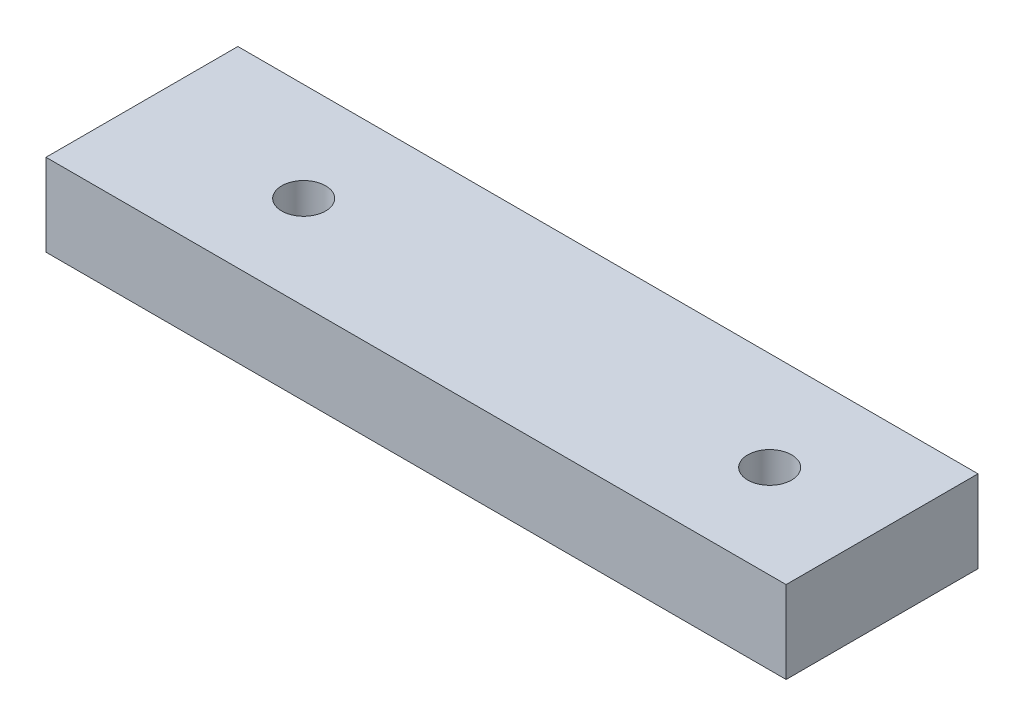
ISO-10303-21;
HEADER;
FILE_DESCRIPTION(('STEP AP214'),'2;1');
FILE_NAME('part.step','',(''),(''),'','','');
FILE_SCHEMA(('AUTOMOTIVE_DESIGN { 1 0 10303 214 1 1 1 1 }'));
ENDSEC;
DATA;
#1=APPLICATION_CONTEXT('core data for automotive mechanical design processes');
#2=APPLICATION_PROTOCOL_DEFINITION('international standard','automotive_design',2000,#1);
#3=PRODUCT_CONTEXT('',#1,'mechanical');
#4=PRODUCT('Part','Part','',(#3));
#5=PRODUCT_RELATED_PRODUCT_CATEGORY('part','',(#4));
#6=PRODUCT_DEFINITION_FORMATION('','',#4);
#7=PRODUCT_DEFINITION_CONTEXT('part definition',#1,'design');
#8=PRODUCT_DEFINITION('design','',#6,#7);
#9=PRODUCT_DEFINITION_SHAPE('','',#8);
#10=(LENGTH_UNIT() NAMED_UNIT(*) SI_UNIT(.MILLI.,.METRE.));
#11=(NAMED_UNIT(*) PLANE_ANGLE_UNIT() SI_UNIT($,.RADIAN.));
#12=(NAMED_UNIT(*) SI_UNIT($,.STERADIAN.) SOLID_ANGLE_UNIT());
#13=UNCERTAINTY_MEASURE_WITH_UNIT(LENGTH_MEASURE(1.E-05),#10,'distance_accuracy_value','');
#14=(GEOMETRIC_REPRESENTATION_CONTEXT(3) GLOBAL_UNCERTAINTY_ASSIGNED_CONTEXT((#13)) GLOBAL_UNIT_ASSIGNED_CONTEXT((#10,
#11,#12)) REPRESENTATION_CONTEXT('',''));
#15=CARTESIAN_POINT('',(0.,0.,0.));
#16=DIRECTION('',(0.,0.,1.));
#17=DIRECTION('',(1.,0.,0.));
#18=AXIS2_PLACEMENT_3D('',#15,#16,#17);
#19=CARTESIAN_POINT('',(0.,0.,35.));
#20=DIRECTION('',(1.,0.,0.));
#21=DIRECTION('',(0.,0.,-1.));
#22=AXIS2_PLACEMENT_3D('',#19,#20,#21);
#23=PLANE('',#22);
#24=DIRECTION('',(0.,-1.,0.));
#25=VECTOR('',#24,1.);
#26=CARTESIAN_POINT('',(0.,0.,0.));
#27=LINE('',#26,#25);
#28=CARTESIAN_POINT('',(0.,15.,0.));
#29=VERTEX_POINT('',#28);
#30=CARTESIAN_POINT('',(0.,0.,0.));
#31=VERTEX_POINT('',#30);
#32=EDGE_CURVE('E98',#29,#31,#27,.T.);
#33=ORIENTED_EDGE('',*,*,#32,.T.);
#34=DIRECTION('',(0.,0.,-1.));
#35=VECTOR('',#34,1.);
#36=CARTESIAN_POINT('',(0.,0.,35.));
#37=LINE('',#36,#35);
#38=CARTESIAN_POINT('',(0.,0.,35.));
#39=VERTEX_POINT('',#38);
#40=EDGE_CURVE('E11',#39,#31,#37,.T.);
#41=ORIENTED_EDGE('',*,*,#40,.F.);
#42=DIRECTION('',(0.,-1.,0.));
#43=VECTOR('',#42,1.);
#44=CARTESIAN_POINT('',(0.,0.,35.));
#45=LINE('',#44,#43);
#46=CARTESIAN_POINT('',(0.,15.,35.));
#47=VERTEX_POINT('',#46);
#48=EDGE_CURVE('E86',#47,#39,#45,.T.);
#49=ORIENTED_EDGE('',*,*,#48,.F.);
#50=DIRECTION('',(0.,0.,-1.));
#51=VECTOR('',#50,1.);
#52=CARTESIAN_POINT('',(0.,15.,35.));
#53=LINE('',#52,#51);
#54=EDGE_CURVE('E94',#47,#29,#53,.T.);
#55=ORIENTED_EDGE('',*,*,#54,.T.);
#56=EDGE_LOOP('',(#33,#41,#49,#55));
#57=FACE_BOUND('',#56,.T.);
#58=ADVANCED_FACE('F35',(#57),#23,.F.);
#59=CARTESIAN_POINT('',(0.,0.,35.));
#60=DIRECTION('',(0.,1.,0.));
#61=DIRECTION('',(0.,0.,1.));
#62=AXIS2_PLACEMENT_3D('',#59,#60,#61);
#63=PLANE('',#62);
#64=CARTESIAN_POINT('',(115.,0.,18.));
#65=DIRECTION('',(0.,1.,0.));
#66=DIRECTION('',(0.,0.,1.));
#67=AXIS2_PLACEMENT_3D('',#64,#65,#66);
#68=CIRCLE('',#67,3.99999999999999);
#69=CARTESIAN_POINT('',(115.,0.,22.));
#70=VERTEX_POINT('',#69);
#71=EDGE_CURVE('E117',#70,#70,#68,.T.);
#72=ORIENTED_EDGE('',*,*,#71,.T.);
#73=EDGE_LOOP('',(#72));
#74=FACE_BOUND('',#73,.T.);
#75=CARTESIAN_POINT('',(30.,0.,18.));
#76=DIRECTION('',(0.,1.,0.));
#77=DIRECTION('',(0.,0.,1.));
#78=AXIS2_PLACEMENT_3D('',#75,#76,#77);
#79=CIRCLE('',#78,4.00000000000001);
#80=CARTESIAN_POINT('',(30.,0.,22.));
#81=VERTEX_POINT('',#80);
#82=EDGE_CURVE('E101',#81,#81,#79,.T.);
#83=ORIENTED_EDGE('',*,*,#82,.T.);
#84=EDGE_LOOP('',(#83));
#85=FACE_BOUND('',#84,.T.);
#86=DIRECTION('',(1.,0.,0.));
#87=VECTOR('',#86,1.);
#88=CARTESIAN_POINT('',(0.,0.,0.));
#89=LINE('',#88,#87);
#90=CARTESIAN_POINT('',(135.,0.,0.));
#91=VERTEX_POINT('',#90);
#92=EDGE_CURVE('E90',#31,#91,#89,.T.);
#93=ORIENTED_EDGE('',*,*,#92,.T.);
#94=DIRECTION('',(0.,0.,-1.));
#95=VECTOR('',#94,1.);
#96=CARTESIAN_POINT('',(135.,0.,35.));
#97=LINE('',#96,#95);
#98=CARTESIAN_POINT('',(135.,0.,35.));
#99=VERTEX_POINT('',#98);
#100=EDGE_CURVE('E43',#99,#91,#97,.T.);
#101=ORIENTED_EDGE('',*,*,#100,.F.);
#102=DIRECTION('',(1.,0.,0.));
#103=VECTOR('',#102,1.);
#104=CARTESIAN_POINT('',(0.,0.,35.));
#105=LINE('',#104,#103);
#106=EDGE_CURVE('E81',#39,#99,#105,.T.);
#107=ORIENTED_EDGE('',*,*,#106,.F.);
#108=ORIENTED_EDGE('',*,*,#40,.T.);
#109=EDGE_LOOP('',(#93,#101,#107,#108));
#110=FACE_BOUND('',#109,.T.);
#111=ADVANCED_FACE('F89',(#74,#85,#110),#63,.F.);
#112=CARTESIAN_POINT('',(135.,0.,35.));
#113=DIRECTION('',(-1.,0.,0.));
#114=DIRECTION('',(0.,0.,1.));
#115=AXIS2_PLACEMENT_3D('',#112,#113,#114);
#116=PLANE('',#115);
#117=DIRECTION('',(0.,1.,0.));
#118=VECTOR('',#117,1.);
#119=CARTESIAN_POINT('',(135.,0.,0.));
#120=LINE('',#119,#118);
#121=CARTESIAN_POINT('',(135.,15.,0.));
#122=VERTEX_POINT('',#121);
#123=EDGE_CURVE('E68',#91,#122,#120,.T.);
#124=ORIENTED_EDGE('',*,*,#123,.T.);
#125=DIRECTION('',(0.,0.,-1.));
#126=VECTOR('',#125,1.);
#127=CARTESIAN_POINT('',(135.,15.,35.));
#128=LINE('',#127,#126);
#129=CARTESIAN_POINT('',(135.,15.,35.));
#130=VERTEX_POINT('',#129);
#131=EDGE_CURVE('E91',#130,#122,#128,.T.);
#132=ORIENTED_EDGE('',*,*,#131,.F.);
#133=DIRECTION('',(0.,1.,0.));
#134=VECTOR('',#133,1.);
#135=CARTESIAN_POINT('',(135.,0.,35.));
#136=LINE('',#135,#134);
#137=EDGE_CURVE('E84',#99,#130,#136,.T.);
#138=ORIENTED_EDGE('',*,*,#137,.F.);
#139=ORIENTED_EDGE('',*,*,#100,.T.);
#140=EDGE_LOOP('',(#124,#132,#138,#139));
#141=FACE_BOUND('',#140,.T.);
#142=ADVANCED_FACE('F92',(#141),#116,.F.);
#143=CARTESIAN_POINT('',(0.,15.,35.));
#144=DIRECTION('',(0.,-1.,0.));
#145=DIRECTION('',(0.,0.,-1.));
#146=AXIS2_PLACEMENT_3D('',#143,#144,#145);
#147=PLANE('',#146);
#148=CARTESIAN_POINT('',(115.,15.,18.));
#149=DIRECTION('',(0.,1.,0.));
#150=DIRECTION('',(0.,0.,1.));
#151=AXIS2_PLACEMENT_3D('',#148,#149,#150);
#152=CIRCLE('',#151,3.99999999999999);
#153=CARTESIAN_POINT('',(115.,15.,22.));
#154=VERTEX_POINT('',#153);
#155=EDGE_CURVE('E120',#154,#154,#152,.T.);
#156=ORIENTED_EDGE('',*,*,#155,.F.);
#157=EDGE_LOOP('',(#156));
#158=FACE_BOUND('',#157,.T.);
#159=CARTESIAN_POINT('',(30.,15.,18.));
#160=DIRECTION('',(0.,1.,0.));
#161=DIRECTION('',(0.,0.,1.));
#162=AXIS2_PLACEMENT_3D('',#159,#160,#161);
#163=CIRCLE('',#162,4.00000000000001);
#164=CARTESIAN_POINT('',(30.,15.,22.));
#165=VERTEX_POINT('',#164);
#166=EDGE_CURVE('E114',#165,#165,#163,.T.);
#167=ORIENTED_EDGE('',*,*,#166,.F.);
#168=EDGE_LOOP('',(#167));
#169=FACE_BOUND('',#168,.T.);
#170=DIRECTION('',(-1.,0.,0.));
#171=VECTOR('',#170,1.);
#172=CARTESIAN_POINT('',(0.,15.,0.));
#173=LINE('',#172,#171);
#174=EDGE_CURVE('E74',#122,#29,#173,.T.);
#175=ORIENTED_EDGE('',*,*,#174,.T.);
#176=ORIENTED_EDGE('',*,*,#54,.F.);
#177=DIRECTION('',(-1.,0.,0.));
#178=VECTOR('',#177,1.);
#179=CARTESIAN_POINT('',(0.,15.,35.));
#180=LINE('',#179,#178);
#181=EDGE_CURVE('E51',#130,#47,#180,.T.);
#182=ORIENTED_EDGE('',*,*,#181,.F.);
#183=ORIENTED_EDGE('',*,*,#131,.T.);
#184=EDGE_LOOP('',(#175,#176,#182,#183));
#185=FACE_BOUND('',#184,.T.);
#186=ADVANCED_FACE('F106',(#158,#169,#185),#147,.F.);
#187=CARTESIAN_POINT('',(0.,0.,35.));
#188=DIRECTION('',(0.,0.,-1.));
#189=DIRECTION('',(-1.,0.,0.));
#190=AXIS2_PLACEMENT_3D('',#187,#188,#189);
#191=PLANE('',#190);
#192=ORIENTED_EDGE('',*,*,#48,.T.);
#193=ORIENTED_EDGE('',*,*,#106,.T.);
#194=ORIENTED_EDGE('',*,*,#137,.T.);
#195=ORIENTED_EDGE('',*,*,#181,.T.);
#196=EDGE_LOOP('',(#192,#193,#194,#195));
#197=FACE_BOUND('',#196,.T.);
#198=ADVANCED_FACE('F82',(#197),#191,.F.);
#199=CARTESIAN_POINT('',(0.,0.,0.));
#200=DIRECTION('',(0.,0.,-1.));
#201=DIRECTION('',(-1.,0.,0.));
#202=AXIS2_PLACEMENT_3D('',#199,#200,#201);
#203=PLANE('',#202);
#204=ORIENTED_EDGE('',*,*,#32,.F.);
#205=ORIENTED_EDGE('',*,*,#174,.F.);
#206=ORIENTED_EDGE('',*,*,#123,.F.);
#207=ORIENTED_EDGE('',*,*,#92,.F.);
#208=EDGE_LOOP('',(#204,#205,#206,#207));
#209=FACE_BOUND('',#208,.T.);
#210=ADVANCED_FACE('F109',(#209),#203,.T.);
#211=CARTESIAN_POINT('',(30.,-35.,18.));
#212=DIRECTION('',(0.,1.,0.));
#213=DIRECTION('',(0.,0.,1.));
#214=AXIS2_PLACEMENT_3D('',#211,#212,#213);
#215=CYLINDRICAL_SURFACE('',#214,4.00000000000001);
#216=ORIENTED_EDGE('',*,*,#166,.T.);
#217=EDGE_LOOP('',(#216));
#218=FACE_BOUND('',#217,.T.);
#219=ORIENTED_EDGE('',*,*,#82,.F.);
#220=EDGE_LOOP('',(#219));
#221=FACE_BOUND('',#220,.T.);
#222=ADVANCED_FACE('F132',(#218,#221),#215,.F.);
#223=CARTESIAN_POINT('',(115.,-35.,18.));
#224=DIRECTION('',(0.,1.,0.));
#225=DIRECTION('',(0.,0.,1.));
#226=AXIS2_PLACEMENT_3D('',#223,#224,#225);
#227=CYLINDRICAL_SURFACE('',#226,3.99999999999999);
#228=ORIENTED_EDGE('',*,*,#155,.T.);
#229=EDGE_LOOP('',(#228));
#230=FACE_BOUND('',#229,.T.);
#231=ORIENTED_EDGE('',*,*,#71,.F.);
#232=EDGE_LOOP('',(#231));
#233=FACE_BOUND('',#232,.T.);
#234=ADVANCED_FACE('F124',(#230,#233),#227,.F.);
#235=CLOSED_SHELL('',(#58,#111,#142,#186,#198,#210,#222,#234));
#236=MANIFOLD_SOLID_BREP('B2',#235);
#237=ADVANCED_BREP_SHAPE_REPRESENTATION('',(#18,#236),#14);
#238=SHAPE_DEFINITION_REPRESENTATION(#9,#237);
ENDSEC;
END-ISO-10303-21;
